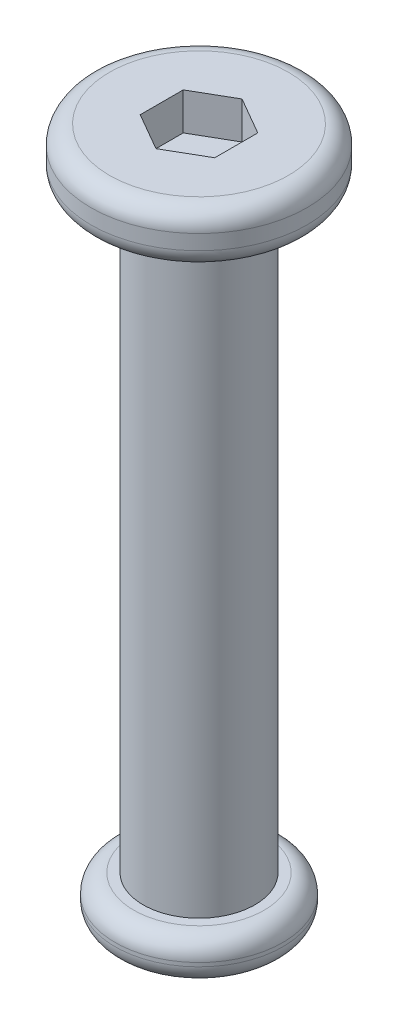
ISO-10303-21;
HEADER;
FILE_DESCRIPTION(('STEP AP214'),'2;1');
FILE_NAME('part.step','',(''),(''),'','','');
FILE_SCHEMA(('AUTOMOTIVE_DESIGN { 1 0 10303 214 1 1 1 1 }'));
ENDSEC;
DATA;
#1=APPLICATION_CONTEXT('core data for automotive mechanical design processes');
#2=APPLICATION_PROTOCOL_DEFINITION('international standard','automotive_design',2000,#1);
#3=PRODUCT_CONTEXT('',#1,'mechanical');
#4=PRODUCT('Part','Part','',(#3));
#5=PRODUCT_RELATED_PRODUCT_CATEGORY('part','',(#4));
#6=PRODUCT_DEFINITION_FORMATION('','',#4);
#7=PRODUCT_DEFINITION_CONTEXT('part definition',#1,'design');
#8=PRODUCT_DEFINITION('design','',#6,#7);
#9=PRODUCT_DEFINITION_SHAPE('','',#8);
#10=(LENGTH_UNIT() NAMED_UNIT(*) SI_UNIT(.MILLI.,.METRE.));
#11=(NAMED_UNIT(*) PLANE_ANGLE_UNIT() SI_UNIT($,.RADIAN.));
#12=(NAMED_UNIT(*) SI_UNIT($,.STERADIAN.) SOLID_ANGLE_UNIT());
#13=UNCERTAINTY_MEASURE_WITH_UNIT(LENGTH_MEASURE(1.E-05),#10,'distance_accuracy_value','');
#14=(GEOMETRIC_REPRESENTATION_CONTEXT(3) GLOBAL_UNCERTAINTY_ASSIGNED_CONTEXT((#13)) GLOBAL_UNIT_ASSIGNED_CONTEXT((#10,
#11,#12)) REPRESENTATION_CONTEXT('',''));
#15=CARTESIAN_POINT('',(0.,0.,0.));
#16=DIRECTION('',(0.,0.,1.));
#17=DIRECTION('',(1.,0.,0.));
#18=AXIS2_PLACEMENT_3D('',#15,#16,#17);
#19=CARTESIAN_POINT('',(0.,1.4,0.));
#20=DIRECTION('',(0.,-1.,0.));
#21=DIRECTION('',(0.,0.,-1.));
#22=AXIS2_PLACEMENT_3D('',#19,#20,#21);
#23=CYLINDRICAL_SURFACE('',#22,2.9);
#24=CARTESIAN_POINT('',(0.,0.9,0.));
#25=DIRECTION('',(0.,1.,0.));
#26=DIRECTION('',(0.,0.,1.));
#27=AXIS2_PLACEMENT_3D('',#24,#25,#26);
#28=CIRCLE('',#27,2.9);
#29=CARTESIAN_POINT('',(0.,0.9,2.9));
#30=VERTEX_POINT('',#29);
#31=EDGE_CURVE('E285',#30,#30,#28,.F.);
#32=ORIENTED_EDGE('',*,*,#31,.T.);
#33=EDGE_LOOP('',(#32));
#34=FACE_BOUND('',#33,.T.);
#35=CARTESIAN_POINT('',(0.,0.5,0.));
#36=DIRECTION('',(0.,1.,0.));
#37=DIRECTION('',(0.,0.,1.));
#38=AXIS2_PLACEMENT_3D('',#35,#36,#37);
#39=CIRCLE('',#38,2.9);
#40=CARTESIAN_POINT('',(0.,0.5,2.9));
#41=VERTEX_POINT('',#40);
#42=EDGE_CURVE('E281',#41,#41,#39,.T.);
#43=ORIENTED_EDGE('',*,*,#42,.T.);
#44=EDGE_LOOP('',(#43));
#45=FACE_BOUND('',#44,.T.);
#46=ADVANCED_FACE('F43',(#34,#45),#23,.T.);
#47=CARTESIAN_POINT('',(0.,1.4,0.));
#48=DIRECTION('',(0.,1.,0.));
#49=DIRECTION('',(0.,0.,1.));
#50=AXIS2_PLACEMENT_3D('',#47,#48,#49);
#51=PLANE('',#50);
#52=CARTESIAN_POINT('',(0.,1.4,0.));
#53=DIRECTION('',(0.,1.,0.));
#54=DIRECTION('',(0.,0.,1.));
#55=AXIS2_PLACEMENT_3D('',#52,#53,#54);
#56=CIRCLE('',#55,2.4);
#57=CARTESIAN_POINT('',(0.,1.4,2.4));
#58=VERTEX_POINT('',#57);
#59=EDGE_CURVE('E213',#58,#58,#56,.T.);
#60=ORIENTED_EDGE('',*,*,#59,.T.);
#61=EDGE_LOOP('',(#60));
#62=FACE_BOUND('',#61,.T.);
#63=DIRECTION('',(0.,0.,-1.));
#64=VECTOR('',#63,1.);
#65=CARTESIAN_POINT('',(1.,1.4,0.577350269189626));
#66=LINE('',#65,#64);
#67=CARTESIAN_POINT('',(1.,1.4,0.577350269189626));
#68=VERTEX_POINT('',#67);
#69=CARTESIAN_POINT('',(1.,1.4,-0.577350269189626));
#70=VERTEX_POINT('',#69);
#71=EDGE_CURVE('E67',#68,#70,#66,.T.);
#72=ORIENTED_EDGE('',*,*,#71,.F.);
#73=DIRECTION('',(0.866025403784439,0.,-0.5));
#74=VECTOR('',#73,1.);
#75=CARTESIAN_POINT('',(0.,1.4,1.15470053837925));
#76=LINE('',#75,#74);
#77=CARTESIAN_POINT('',(0.,1.4,1.15470053837925));
#78=VERTEX_POINT('',#77);
#79=EDGE_CURVE('E220',#78,#68,#76,.T.);
#80=ORIENTED_EDGE('',*,*,#79,.F.);
#81=DIRECTION('',(0.866025403784438,0.,0.5));
#82=VECTOR('',#81,1.);
#83=CARTESIAN_POINT('',(-1.,1.4,0.577350269189626));
#84=LINE('',#83,#82);
#85=CARTESIAN_POINT('',(-1.,1.4,0.577350269189626));
#86=VERTEX_POINT('',#85);
#87=EDGE_CURVE('E255',#86,#78,#84,.T.);
#88=ORIENTED_EDGE('',*,*,#87,.F.);
#89=DIRECTION('',(0.,0.,1.));
#90=VECTOR('',#89,1.);
#91=CARTESIAN_POINT('',(-1.,1.4,-0.577350269189626));
#92=LINE('',#91,#90);
#93=CARTESIAN_POINT('',(-1.,1.4,-0.577350269189626));
#94=VERTEX_POINT('',#93);
#95=EDGE_CURVE('E251',#94,#86,#92,.T.);
#96=ORIENTED_EDGE('',*,*,#95,.F.);
#97=DIRECTION('',(-0.866025403784439,0.,0.5));
#98=VECTOR('',#97,1.);
#99=CARTESIAN_POINT('',(0.,1.4,-1.15470053837925));
#100=LINE('',#99,#98);
#101=CARTESIAN_POINT('',(0.,1.4,-1.15470053837925));
#102=VERTEX_POINT('',#101);
#103=EDGE_CURVE('E247',#102,#94,#100,.T.);
#104=ORIENTED_EDGE('',*,*,#103,.F.);
#105=DIRECTION('',(-0.866025403784438,0.,-0.5));
#106=VECTOR('',#105,1.);
#107=CARTESIAN_POINT('',(1.,1.4,-0.577350269189626));
#108=LINE('',#107,#106);
#109=EDGE_CURVE('E243',#70,#102,#108,.T.);
#110=ORIENTED_EDGE('',*,*,#109,.F.);
#111=EDGE_LOOP('',(#72,#80,#88,#96,#104,#110));
#112=FACE_BOUND('',#111,.T.);
#113=ADVANCED_FACE('F352',(#62,#112),#51,.T.);
#114=CARTESIAN_POINT('',(0.,0.,0.));
#115=DIRECTION('',(0.,1.,0.));
#116=DIRECTION('',(0.,0.,1.));
#117=AXIS2_PLACEMENT_3D('',#114,#115,#116);
#118=PLANE('',#117);
#119=CARTESIAN_POINT('',(0.,0.,0.));
#120=DIRECTION('',(0.,1.,0.));
#121=DIRECTION('',(0.,0.,1.));
#122=AXIS2_PLACEMENT_3D('',#119,#120,#121);
#123=CIRCLE('',#122,2.4);
#124=CARTESIAN_POINT('',(0.,0.,2.4));
#125=VERTEX_POINT('',#124);
#126=EDGE_CURVE('E289',#125,#125,#123,.F.);
#127=ORIENTED_EDGE('',*,*,#126,.T.);
#128=EDGE_LOOP('',(#127));
#129=FACE_BOUND('',#128,.T.);
#130=CARTESIAN_POINT('',(0.,0.,0.));
#131=DIRECTION('',(0.,-1.,0.));
#132=DIRECTION('',(0.,0.,-1.));
#133=AXIS2_PLACEMENT_3D('',#130,#131,#132);
#134=CIRCLE('',#133,1.5);
#135=CARTESIAN_POINT('',(0.,0.,-1.5));
#136=VERTEX_POINT('',#135);
#137=EDGE_CURVE('E209',#136,#136,#134,.T.);
#138=ORIENTED_EDGE('',*,*,#137,.F.);
#139=EDGE_LOOP('',(#138));
#140=FACE_BOUND('',#139,.T.);
#141=ADVANCED_FACE('F358',(#129,#140),#118,.F.);
#142=CARTESIAN_POINT('',(1.,0.4,0.577350269189626));
#143=DIRECTION('',(1.,0.,0.));
#144=DIRECTION('',(0.,0.,-1.));
#145=AXIS2_PLACEMENT_3D('',#142,#143,#144);
#146=PLANE('',#145);
#147=ORIENTED_EDGE('',*,*,#71,.T.);
#148=DIRECTION('',(0.,1.,0.));
#149=VECTOR('',#148,1.);
#150=CARTESIAN_POINT('',(1.,0.4,-0.577350269189626));
#151=LINE('',#150,#149);
#152=CARTESIAN_POINT('',(1.,0.4,-0.577350269189626));
#153=VERTEX_POINT('',#152);
#154=EDGE_CURVE('E240',#153,#70,#151,.T.);
#155=ORIENTED_EDGE('',*,*,#154,.F.);
#156=DIRECTION('',(0.,0.,-1.));
#157=VECTOR('',#156,1.);
#158=CARTESIAN_POINT('',(1.,0.4,0.577350269189626));
#159=LINE('',#158,#157);
#160=CARTESIAN_POINT('',(1.,0.4,0.577350269189626));
#161=VERTEX_POINT('',#160);
#162=EDGE_CURVE('E215',#161,#153,#159,.T.);
#163=ORIENTED_EDGE('',*,*,#162,.F.);
#164=DIRECTION('',(0.,1.,0.));
#165=VECTOR('',#164,1.);
#166=CARTESIAN_POINT('',(1.,0.4,0.577350269189626));
#167=LINE('',#166,#165);
#168=EDGE_CURVE('E214',#161,#68,#167,.T.);
#169=ORIENTED_EDGE('',*,*,#168,.T.);
#170=EDGE_LOOP('',(#147,#155,#163,#169));
#171=FACE_BOUND('',#170,.T.);
#172=ADVANCED_FACE('F378',(#171),#146,.F.);
#173=CARTESIAN_POINT('',(0.,0.4,1.15470053837925));
#174=DIRECTION('',(0.5,0.,0.866025403784439));
#175=DIRECTION('',(0.866025403784439,0.,-0.5));
#176=AXIS2_PLACEMENT_3D('',#173,#174,#175);
#177=PLANE('',#176);
#178=ORIENTED_EDGE('',*,*,#79,.T.);
#179=ORIENTED_EDGE('',*,*,#168,.F.);
#180=DIRECTION('',(0.866025403784439,0.,-0.5));
#181=VECTOR('',#180,1.);
#182=CARTESIAN_POINT('',(0.,0.4,1.15470053837925));
#183=LINE('',#182,#181);
#184=CARTESIAN_POINT('',(0.,0.4,1.15470053837925));
#185=VERTEX_POINT('',#184);
#186=EDGE_CURVE('E236',#185,#161,#183,.T.);
#187=ORIENTED_EDGE('',*,*,#186,.F.);
#188=DIRECTION('',(0.,1.,0.));
#189=VECTOR('',#188,1.);
#190=CARTESIAN_POINT('',(0.,0.4,1.15470053837925));
#191=LINE('',#190,#189);
#192=EDGE_CURVE('E264',#185,#78,#191,.T.);
#193=ORIENTED_EDGE('',*,*,#192,.T.);
#194=EDGE_LOOP('',(#178,#179,#187,#193));
#195=FACE_BOUND('',#194,.T.);
#196=ADVANCED_FACE('F394',(#195),#177,.F.);
#197=CARTESIAN_POINT('',(-1.,0.4,0.577350269189626));
#198=DIRECTION('',(-0.5,0.,0.866025403784439));
#199=DIRECTION('',(0.866025403784438,0.,0.5));
#200=AXIS2_PLACEMENT_3D('',#197,#198,#199);
#201=PLANE('',#200);
#202=ORIENTED_EDGE('',*,*,#87,.T.);
#203=ORIENTED_EDGE('',*,*,#192,.F.);
#204=DIRECTION('',(0.866025403784438,0.,0.5));
#205=VECTOR('',#204,1.);
#206=CARTESIAN_POINT('',(-1.,0.4,0.577350269189626));
#207=LINE('',#206,#205);
#208=CARTESIAN_POINT('',(-1.,0.4,0.577350269189626));
#209=VERTEX_POINT('',#208);
#210=EDGE_CURVE('E232',#209,#185,#207,.T.);
#211=ORIENTED_EDGE('',*,*,#210,.F.);
#212=DIRECTION('',(0.,1.,0.));
#213=VECTOR('',#212,1.);
#214=CARTESIAN_POINT('',(-1.,0.4,0.577350269189626));
#215=LINE('',#214,#213);
#216=EDGE_CURVE('E267',#209,#86,#215,.T.);
#217=ORIENTED_EDGE('',*,*,#216,.T.);
#218=EDGE_LOOP('',(#202,#203,#211,#217));
#219=FACE_BOUND('',#218,.T.);
#220=ADVANCED_FACE('F397',(#219),#201,.F.);
#221=CARTESIAN_POINT('',(-1.,0.4,-0.577350269189626));
#222=DIRECTION('',(-1.,0.,0.));
#223=DIRECTION('',(0.,0.,1.));
#224=AXIS2_PLACEMENT_3D('',#221,#222,#223);
#225=PLANE('',#224);
#226=ORIENTED_EDGE('',*,*,#95,.T.);
#227=ORIENTED_EDGE('',*,*,#216,.F.);
#228=DIRECTION('',(0.,0.,1.));
#229=VECTOR('',#228,1.);
#230=CARTESIAN_POINT('',(-1.,0.4,-0.577350269189626));
#231=LINE('',#230,#229);
#232=CARTESIAN_POINT('',(-1.,0.4,-0.577350269189626));
#233=VERTEX_POINT('',#232);
#234=EDGE_CURVE('E228',#233,#209,#231,.T.);
#235=ORIENTED_EDGE('',*,*,#234,.F.);
#236=DIRECTION('',(0.,1.,0.));
#237=VECTOR('',#236,1.);
#238=CARTESIAN_POINT('',(-1.,0.4,-0.577350269189626));
#239=LINE('',#238,#237);
#240=EDGE_CURVE('E270',#233,#94,#239,.T.);
#241=ORIENTED_EDGE('',*,*,#240,.T.);
#242=EDGE_LOOP('',(#226,#227,#235,#241));
#243=FACE_BOUND('',#242,.T.);
#244=ADVANCED_FACE('F401',(#243),#225,.F.);
#245=CARTESIAN_POINT('',(0.,0.4,-1.15470053837925));
#246=DIRECTION('',(-0.5,0.,-0.866025403784439));
#247=DIRECTION('',(-0.866025403784439,0.,0.5));
#248=AXIS2_PLACEMENT_3D('',#245,#246,#247);
#249=PLANE('',#248);
#250=ORIENTED_EDGE('',*,*,#103,.T.);
#251=ORIENTED_EDGE('',*,*,#240,.F.);
#252=DIRECTION('',(-0.866025403784439,0.,0.5));
#253=VECTOR('',#252,1.);
#254=CARTESIAN_POINT('',(0.,0.4,-1.15470053837925));
#255=LINE('',#254,#253);
#256=CARTESIAN_POINT('',(0.,0.4,-1.15470053837925));
#257=VERTEX_POINT('',#256);
#258=EDGE_CURVE('E224',#257,#233,#255,.T.);
#259=ORIENTED_EDGE('',*,*,#258,.F.);
#260=DIRECTION('',(0.,1.,0.));
#261=VECTOR('',#260,1.);
#262=CARTESIAN_POINT('',(0.,0.4,-1.15470053837925));
#263=LINE('',#262,#261);
#264=EDGE_CURVE('E273',#257,#102,#263,.T.);
#265=ORIENTED_EDGE('',*,*,#264,.T.);
#266=EDGE_LOOP('',(#250,#251,#259,#265));
#267=FACE_BOUND('',#266,.T.);
#268=ADVANCED_FACE('F405',(#267),#249,.F.);
#269=CARTESIAN_POINT('',(1.,0.4,-0.577350269189626));
#270=DIRECTION('',(0.5,0.,-0.866025403784439));
#271=DIRECTION('',(-0.866025403784439,0.,-0.5));
#272=AXIS2_PLACEMENT_3D('',#269,#270,#271);
#273=PLANE('',#272);
#274=ORIENTED_EDGE('',*,*,#109,.T.);
#275=ORIENTED_EDGE('',*,*,#264,.F.);
#276=DIRECTION('',(-0.866025403784438,0.,-0.5));
#277=VECTOR('',#276,1.);
#278=CARTESIAN_POINT('',(1.,0.4,-0.577350269189626));
#279=LINE('',#278,#277);
#280=EDGE_CURVE('E219',#153,#257,#279,.T.);
#281=ORIENTED_EDGE('',*,*,#280,.F.);
#282=ORIENTED_EDGE('',*,*,#154,.T.);
#283=EDGE_LOOP('',(#274,#275,#281,#282));
#284=FACE_BOUND('',#283,.T.);
#285=ADVANCED_FACE('F388',(#284),#273,.F.);
#286=CARTESIAN_POINT('',(0.,0.4,0.));
#287=DIRECTION('',(0.,1.,0.));
#288=DIRECTION('',(0.,0.,1.));
#289=AXIS2_PLACEMENT_3D('',#286,#287,#288);
#290=PLANE('',#289);
#291=ORIENTED_EDGE('',*,*,#162,.T.);
#292=ORIENTED_EDGE('',*,*,#280,.T.);
#293=ORIENTED_EDGE('',*,*,#258,.T.);
#294=ORIENTED_EDGE('',*,*,#234,.T.);
#295=ORIENTED_EDGE('',*,*,#210,.T.);
#296=ORIENTED_EDGE('',*,*,#186,.T.);
#297=EDGE_LOOP('',(#291,#292,#293,#294,#295,#296));
#298=FACE_BOUND('',#297,.T.);
#299=ADVANCED_FACE('F382',(#298),#290,.T.);
#300=CARTESIAN_POINT('',(0.,-16.,0.));
#301=DIRECTION('',(0.,1.,0.));
#302=DIRECTION('',(0.,0.,1.));
#303=AXIS2_PLACEMENT_3D('',#300,#301,#302);
#304=CYLINDRICAL_SURFACE('',#303,1.5);
#305=CARTESIAN_POINT('',(0.,-16.,0.));
#306=DIRECTION('',(0.,-1.,0.));
#307=DIRECTION('',(0.,0.,-1.));
#308=AXIS2_PLACEMENT_3D('',#305,#306,#307);
#309=CIRCLE('',#308,1.5);
#310=CARTESIAN_POINT('',(0.,-16.,-1.5));
#311=VERTEX_POINT('',#310);
#312=EDGE_CURVE('E194',#311,#311,#309,.T.);
#313=ORIENTED_EDGE('',*,*,#312,.F.);
#314=EDGE_LOOP('',(#313));
#315=FACE_BOUND('',#314,.T.);
#316=ORIENTED_EDGE('',*,*,#137,.T.);
#317=EDGE_LOOP('',(#316));
#318=FACE_BOUND('',#317,.T.);
#319=ADVANCED_FACE('F317',(#315,#318),#304,.T.);
#320=CARTESIAN_POINT('',(0.,-17.1,0.));
#321=DIRECTION('',(0.,1.,0.));
#322=DIRECTION('',(0.,0.,1.));
#323=AXIS2_PLACEMENT_3D('',#320,#321,#322);
#324=CYLINDRICAL_SURFACE('',#323,2.25);
#325=CARTESIAN_POINT('',(0.,-16.5,0.));
#326=DIRECTION('',(0.,-1.,0.));
#327=DIRECTION('',(0.,0.,-1.));
#328=AXIS2_PLACEMENT_3D('',#325,#326,#327);
#329=CIRCLE('',#328,2.25);
#330=CARTESIAN_POINT('',(0.,-16.5,-2.25));
#331=VERTEX_POINT('',#330);
#332=EDGE_CURVE('E297',#331,#331,#329,.T.);
#333=ORIENTED_EDGE('',*,*,#332,.T.);
#334=EDGE_LOOP('',(#333));
#335=FACE_BOUND('',#334,.T.);
#336=CARTESIAN_POINT('',(0.,-16.6,0.));
#337=DIRECTION('',(0.,-1.,0.));
#338=DIRECTION('',(0.,0.,-1.));
#339=AXIS2_PLACEMENT_3D('',#336,#337,#338);
#340=CIRCLE('',#339,2.25);
#341=CARTESIAN_POINT('',(0.,-16.6,-2.25));
#342=VERTEX_POINT('',#341);
#343=EDGE_CURVE('E293',#342,#342,#340,.F.);
#344=ORIENTED_EDGE('',*,*,#343,.T.);
#345=EDGE_LOOP('',(#344));
#346=FACE_BOUND('',#345,.T.);
#347=ADVANCED_FACE('F313',(#335,#346),#324,.T.);
#348=CARTESIAN_POINT('',(0.,-17.1,0.));
#349=DIRECTION('',(0.,-1.,0.));
#350=DIRECTION('',(0.,0.,-1.));
#351=AXIS2_PLACEMENT_3D('',#348,#349,#350);
#352=PLANE('',#351);
#353=CARTESIAN_POINT('',(0.,-17.1,0.));
#354=DIRECTION('',(0.,-1.,0.));
#355=DIRECTION('',(0.,0.,-1.));
#356=AXIS2_PLACEMENT_3D('',#353,#354,#355);
#357=CIRCLE('',#356,1.75);
#358=CARTESIAN_POINT('',(0.,-17.1,-1.75));
#359=VERTEX_POINT('',#358);
#360=EDGE_CURVE('E11',#359,#359,#357,.T.);
#361=ORIENTED_EDGE('',*,*,#360,.T.);
#362=EDGE_LOOP('',(#361));
#363=FACE_BOUND('',#362,.T.);
#364=DIRECTION('',(0.,0.,1.));
#365=VECTOR('',#364,1.);
#366=CARTESIAN_POINT('',(0.65,-17.1,-0.375277674973256));
#367=LINE('',#366,#365);
#368=CARTESIAN_POINT('',(0.65,-17.1,-0.375277674973256));
#369=VERTEX_POINT('',#368);
#370=CARTESIAN_POINT('',(0.649999999999999,-17.1,0.375277674973257));
#371=VERTEX_POINT('',#370);
#372=EDGE_CURVE('E59',#369,#371,#367,.T.);
#373=ORIENTED_EDGE('',*,*,#372,.F.);
#374=DIRECTION('',(0.866025403784438,0.,0.500000000000001));
#375=VECTOR('',#374,1.);
#376=CARTESIAN_POINT('',(0.,-17.1,-0.750555349946513));
#377=LINE('',#376,#375);
#378=CARTESIAN_POINT('',(0.,-17.1,-0.750555349946513));
#379=VERTEX_POINT('',#378);
#380=EDGE_CURVE('E157',#379,#369,#377,.T.);
#381=ORIENTED_EDGE('',*,*,#380,.F.);
#382=DIRECTION('',(0.866025403784439,0.,-0.499999999999999));
#383=VECTOR('',#382,1.);
#384=CARTESIAN_POINT('',(-0.649999999999999,-17.1,-0.375277674973257));
#385=LINE('',#384,#383);
#386=CARTESIAN_POINT('',(-0.649999999999999,-17.1,-0.375277674973257));
#387=VERTEX_POINT('',#386);
#388=EDGE_CURVE('E161',#387,#379,#385,.T.);
#389=ORIENTED_EDGE('',*,*,#388,.F.);
#390=DIRECTION('',(0.,0.,-1.));
#391=VECTOR('',#390,1.);
#392=CARTESIAN_POINT('',(-0.65,-17.1,0.375277674973256));
#393=LINE('',#392,#391);
#394=CARTESIAN_POINT('',(-0.65,-17.1,0.375277674973256));
#395=VERTEX_POINT('',#394);
#396=EDGE_CURVE('E184',#395,#387,#393,.T.);
#397=ORIENTED_EDGE('',*,*,#396,.F.);
#398=DIRECTION('',(-0.866025403784438,0.,-0.500000000000001));
#399=VECTOR('',#398,1.);
#400=CARTESIAN_POINT('',(0.,-17.1,0.750555349946514));
#401=LINE('',#400,#399);
#402=CARTESIAN_POINT('',(0.,-17.1,0.750555349946514));
#403=VERTEX_POINT('',#402);
#404=EDGE_CURVE('E180',#403,#395,#401,.T.);
#405=ORIENTED_EDGE('',*,*,#404,.F.);
#406=DIRECTION('',(-0.866025403784439,0.,0.5));
#407=VECTOR('',#406,1.);
#408=CARTESIAN_POINT('',(0.649999999999999,-17.1,0.375277674973257));
#409=LINE('',#408,#407);
#410=EDGE_CURVE('E177',#371,#403,#409,.T.);
#411=ORIENTED_EDGE('',*,*,#410,.F.);
#412=EDGE_LOOP('',(#373,#381,#389,#397,#405,#411));
#413=FACE_BOUND('',#412,.T.);
#414=ADVANCED_FACE('F316',(#363,#413),#352,.T.);
#415=CARTESIAN_POINT('',(0.,-16.,0.));
#416=DIRECTION('',(0.,-1.,0.));
#417=DIRECTION('',(0.,0.,-1.));
#418=AXIS2_PLACEMENT_3D('',#415,#416,#417);
#419=PLANE('',#418);
#420=CARTESIAN_POINT('',(0.,-16.,0.));
#421=DIRECTION('',(0.,-1.,0.));
#422=DIRECTION('',(0.,0.,-1.));
#423=AXIS2_PLACEMENT_3D('',#420,#421,#422);
#424=CIRCLE('',#423,1.75);
#425=CARTESIAN_POINT('',(0.,-16.,-1.75));
#426=VERTEX_POINT('',#425);
#427=EDGE_CURVE('E52',#426,#426,#424,.F.);
#428=ORIENTED_EDGE('',*,*,#427,.T.);
#429=EDGE_LOOP('',(#428));
#430=FACE_BOUND('',#429,.T.);
#431=ORIENTED_EDGE('',*,*,#312,.T.);
#432=EDGE_LOOP('',(#431));
#433=FACE_BOUND('',#432,.T.);
#434=ADVANCED_FACE('F304',(#430,#433),#419,.F.);
#435=CARTESIAN_POINT('',(0.65,-16.3,-0.375277674973256));
#436=DIRECTION('',(1.,0.,0.));
#437=DIRECTION('',(0.,0.,-1.));
#438=AXIS2_PLACEMENT_3D('',#435,#436,#437);
#439=PLANE('',#438);
#440=ORIENTED_EDGE('',*,*,#372,.T.);
#441=DIRECTION('',(0.,-1.,0.));
#442=VECTOR('',#441,1.);
#443=CARTESIAN_POINT('',(0.649999999999999,-16.3,0.375277674973257));
#444=LINE('',#443,#442);
#445=CARTESIAN_POINT('',(0.649999999999999,-16.3,0.375277674973257));
#446=VERTEX_POINT('',#445);
#447=EDGE_CURVE('E131',#446,#371,#444,.T.);
#448=ORIENTED_EDGE('',*,*,#447,.F.);
#449=DIRECTION('',(0.,0.,1.));
#450=VECTOR('',#449,1.);
#451=CARTESIAN_POINT('',(0.65,-16.3,-0.375277674973256));
#452=LINE('',#451,#450);
#453=CARTESIAN_POINT('',(0.65,-16.3,-0.375277674973256));
#454=VERTEX_POINT('',#453);
#455=EDGE_CURVE('E135',#454,#446,#452,.T.);
#456=ORIENTED_EDGE('',*,*,#455,.F.);
#457=DIRECTION('',(0.,-1.,0.));
#458=VECTOR('',#457,1.);
#459=CARTESIAN_POINT('',(0.65,-16.3,-0.375277674973256));
#460=LINE('',#459,#458);
#461=EDGE_CURVE('E191',#454,#369,#460,.T.);
#462=ORIENTED_EDGE('',*,*,#461,.T.);
#463=EDGE_LOOP('',(#440,#448,#456,#462));
#464=FACE_BOUND('',#463,.T.);
#465=ADVANCED_FACE('F133',(#464),#439,.F.);
#466=CARTESIAN_POINT('',(0.,-16.3,-0.750555349946513));
#467=DIRECTION('',(0.500000000000001,0.,-0.866025403784438));
#468=DIRECTION('',(-0.866025403784438,0.,-0.500000000000001));
#469=AXIS2_PLACEMENT_3D('',#466,#467,#468);
#470=PLANE('',#469);
#471=ORIENTED_EDGE('',*,*,#380,.T.);
#472=ORIENTED_EDGE('',*,*,#461,.F.);
#473=DIRECTION('',(0.866025403784438,0.,0.500000000000001));
#474=VECTOR('',#473,1.);
#475=CARTESIAN_POINT('',(0.,-16.3,-0.750555349946513));
#476=LINE('',#475,#474);
#477=CARTESIAN_POINT('',(0.,-16.3,-0.750555349946513));
#478=VERTEX_POINT('',#477);
#479=EDGE_CURVE('E142',#478,#454,#476,.T.);
#480=ORIENTED_EDGE('',*,*,#479,.F.);
#481=DIRECTION('',(0.,-1.,0.));
#482=VECTOR('',#481,1.);
#483=CARTESIAN_POINT('',(0.,-16.3,-0.750555349946513));
#484=LINE('',#483,#482);
#485=EDGE_CURVE('E195',#478,#379,#484,.T.);
#486=ORIENTED_EDGE('',*,*,#485,.T.);
#487=EDGE_LOOP('',(#471,#472,#480,#486));
#488=FACE_BOUND('',#487,.T.);
#489=ADVANCED_FACE('F341',(#488),#470,.F.);
#490=CARTESIAN_POINT('',(-0.649999999999999,-16.3,-0.375277674973257));
#491=DIRECTION('',(-0.5,0.,-0.866025403784439));
#492=DIRECTION('',(-0.866025403784439,0.,0.5));
#493=AXIS2_PLACEMENT_3D('',#490,#491,#492);
#494=PLANE('',#493);
#495=ORIENTED_EDGE('',*,*,#388,.T.);
#496=ORIENTED_EDGE('',*,*,#485,.F.);
#497=DIRECTION('',(0.866025403784439,0.,-0.499999999999999));
#498=VECTOR('',#497,1.);
#499=CARTESIAN_POINT('',(-0.649999999999999,-16.3,-0.375277674973257));
#500=LINE('',#499,#498);
#501=CARTESIAN_POINT('',(-0.649999999999999,-16.3,-0.375277674973257));
#502=VERTEX_POINT('',#501);
#503=EDGE_CURVE('E170',#502,#478,#500,.T.);
#504=ORIENTED_EDGE('',*,*,#503,.F.);
#505=DIRECTION('',(0.,-1.,0.));
#506=VECTOR('',#505,1.);
#507=CARTESIAN_POINT('',(-0.649999999999999,-16.3,-0.375277674973257));
#508=LINE('',#507,#506);
#509=EDGE_CURVE('E198',#502,#387,#508,.T.);
#510=ORIENTED_EDGE('',*,*,#509,.T.);
#511=EDGE_LOOP('',(#495,#496,#504,#510));
#512=FACE_BOUND('',#511,.T.);
#513=ADVANCED_FACE('F339',(#512),#494,.F.);
#514=CARTESIAN_POINT('',(-0.65,-16.3,0.375277674973256));
#515=DIRECTION('',(-1.,0.,0.));
#516=DIRECTION('',(0.,0.,1.));
#517=AXIS2_PLACEMENT_3D('',#514,#515,#516);
#518=PLANE('',#517);
#519=ORIENTED_EDGE('',*,*,#396,.T.);
#520=ORIENTED_EDGE('',*,*,#509,.F.);
#521=DIRECTION('',(0.,0.,-1.));
#522=VECTOR('',#521,1.);
#523=CARTESIAN_POINT('',(-0.65,-16.3,0.375277674973256));
#524=LINE('',#523,#522);
#525=CARTESIAN_POINT('',(-0.65,-16.3,0.375277674973256));
#526=VERTEX_POINT('',#525);
#527=EDGE_CURVE('E166',#526,#502,#524,.T.);
#528=ORIENTED_EDGE('',*,*,#527,.F.);
#529=DIRECTION('',(0.,-1.,0.));
#530=VECTOR('',#529,1.);
#531=CARTESIAN_POINT('',(-0.65,-16.3,0.375277674973256));
#532=LINE('',#531,#530);
#533=EDGE_CURVE('E201',#526,#395,#532,.T.);
#534=ORIENTED_EDGE('',*,*,#533,.T.);
#535=EDGE_LOOP('',(#519,#520,#528,#534));
#536=FACE_BOUND('',#535,.T.);
#537=ADVANCED_FACE('F337',(#536),#518,.F.);
#538=CARTESIAN_POINT('',(0.,-16.3,0.750555349946514));
#539=DIRECTION('',(-0.500000000000001,0.,0.866025403784438));
#540=DIRECTION('',(0.866025403784438,0.,0.500000000000001));
#541=AXIS2_PLACEMENT_3D('',#538,#539,#540);
#542=PLANE('',#541);
#543=ORIENTED_EDGE('',*,*,#404,.T.);
#544=ORIENTED_EDGE('',*,*,#533,.F.);
#545=DIRECTION('',(-0.866025403784438,0.,-0.500000000000001));
#546=VECTOR('',#545,1.);
#547=CARTESIAN_POINT('',(0.,-16.3,0.750555349946514));
#548=LINE('',#547,#546);
#549=CARTESIAN_POINT('',(0.,-16.3,0.750555349946514));
#550=VERTEX_POINT('',#549);
#551=EDGE_CURVE('E151',#550,#526,#548,.T.);
#552=ORIENTED_EDGE('',*,*,#551,.F.);
#553=DIRECTION('',(0.,-1.,0.));
#554=VECTOR('',#553,1.);
#555=CARTESIAN_POINT('',(0.,-16.3,0.750555349946514));
#556=LINE('',#555,#554);
#557=EDGE_CURVE('E141',#550,#403,#556,.T.);
#558=ORIENTED_EDGE('',*,*,#557,.T.);
#559=EDGE_LOOP('',(#543,#544,#552,#558));
#560=FACE_BOUND('',#559,.T.);
#561=ADVANCED_FACE('F333',(#560),#542,.F.);
#562=CARTESIAN_POINT('',(0.649999999999999,-16.3,0.375277674973257));
#563=DIRECTION('',(0.5,0.,0.866025403784439));
#564=DIRECTION('',(0.866025403784439,0.,-0.5));
#565=AXIS2_PLACEMENT_3D('',#562,#563,#564);
#566=PLANE('',#565);
#567=ORIENTED_EDGE('',*,*,#410,.T.);
#568=ORIENTED_EDGE('',*,*,#557,.F.);
#569=DIRECTION('',(-0.866025403784439,0.,0.5));
#570=VECTOR('',#569,1.);
#571=CARTESIAN_POINT('',(0.649999999999999,-16.3,0.375277674973257));
#572=LINE('',#571,#570);
#573=EDGE_CURVE('E145',#446,#550,#572,.T.);
#574=ORIENTED_EDGE('',*,*,#573,.F.);
#575=ORIENTED_EDGE('',*,*,#447,.T.);
#576=EDGE_LOOP('',(#567,#568,#574,#575));
#577=FACE_BOUND('',#576,.T.);
#578=ADVANCED_FACE('F146',(#577),#566,.F.);
#579=CARTESIAN_POINT('',(0.,-16.3,0.));
#580=DIRECTION('',(0.,-1.,0.));
#581=DIRECTION('',(0.,0.,-1.));
#582=AXIS2_PLACEMENT_3D('',#579,#580,#581);
#583=PLANE('',#582);
#584=ORIENTED_EDGE('',*,*,#455,.T.);
#585=ORIENTED_EDGE('',*,*,#573,.T.);
#586=ORIENTED_EDGE('',*,*,#551,.T.);
#587=ORIENTED_EDGE('',*,*,#527,.T.);
#588=ORIENTED_EDGE('',*,*,#503,.T.);
#589=ORIENTED_EDGE('',*,*,#479,.T.);
#590=EDGE_LOOP('',(#584,#585,#586,#587,#588,#589));
#591=FACE_BOUND('',#590,.T.);
#592=ADVANCED_FACE('F153',(#591),#583,.T.);
#593=CARTESIAN_POINT('',(0.,0.9,0.));
#594=DIRECTION('',(0.,1.,0.));
#595=DIRECTION('',(0.,0.,1.));
#596=AXIS2_PLACEMENT_3D('',#593,#594,#595);
#597=TOROIDAL_SURFACE('',#596,2.4,0.5);
#598=ORIENTED_EDGE('',*,*,#31,.F.);
#599=EDGE_LOOP('',(#598));
#600=FACE_BOUND('',#599,.T.);
#601=ORIENTED_EDGE('',*,*,#59,.F.);
#602=EDGE_LOOP('',(#601));
#603=FACE_BOUND('',#602,.T.);
#604=ADVANCED_FACE('F364',(#600,#603),#597,.T.);
#605=CARTESIAN_POINT('',(0.,0.5,0.));
#606=DIRECTION('',(0.,1.,0.));
#607=DIRECTION('',(0.,0.,1.));
#608=AXIS2_PLACEMENT_3D('',#605,#606,#607);
#609=TOROIDAL_SURFACE('',#608,2.4,0.5);
#610=ORIENTED_EDGE('',*,*,#126,.F.);
#611=EDGE_LOOP('',(#610));
#612=FACE_BOUND('',#611,.T.);
#613=ORIENTED_EDGE('',*,*,#42,.F.);
#614=EDGE_LOOP('',(#613));
#615=FACE_BOUND('',#614,.T.);
#616=ADVANCED_FACE('F310',(#612,#615),#609,.T.);
#617=CARTESIAN_POINT('',(0.,-16.5,0.));
#618=DIRECTION('',(0.,-1.,0.));
#619=DIRECTION('',(0.,0.,-1.));
#620=AXIS2_PLACEMENT_3D('',#617,#618,#619);
#621=TOROIDAL_SURFACE('',#620,1.75,0.5);
#622=ORIENTED_EDGE('',*,*,#427,.F.);
#623=EDGE_LOOP('',(#622));
#624=FACE_BOUND('',#623,.T.);
#625=ORIENTED_EDGE('',*,*,#332,.F.);
#626=EDGE_LOOP('',(#625));
#627=FACE_BOUND('',#626,.T.);
#628=ADVANCED_FACE('F307',(#624,#627),#621,.T.);
#629=CARTESIAN_POINT('',(0.,-16.6,0.));
#630=DIRECTION('',(0.,-1.,0.));
#631=DIRECTION('',(0.,0.,-1.));
#632=AXIS2_PLACEMENT_3D('',#629,#630,#631);
#633=TOROIDAL_SURFACE('',#632,1.75,0.5);
#634=ORIENTED_EDGE('',*,*,#343,.F.);
#635=EDGE_LOOP('',(#634));
#636=FACE_BOUND('',#635,.T.);
#637=ORIENTED_EDGE('',*,*,#360,.F.);
#638=EDGE_LOOP('',(#637));
#639=FACE_BOUND('',#638,.T.);
#640=ADVANCED_FACE('F45',(#636,#639),#633,.T.);
#641=CLOSED_SHELL('',(#46,#113,#141,#172,#196,#220,#244,#268,#285,#299,#319,#347,#414,#434,#465,
#489,#513,#537,#561,#578,#592,#604,#616,#628,#640));
#642=MANIFOLD_SOLID_BREP('B2',#641);
#643=ADVANCED_BREP_SHAPE_REPRESENTATION('',(#18,#642),#14);
#644=SHAPE_DEFINITION_REPRESENTATION(#9,#643);
ENDSEC;
END-ISO-10303-21;
